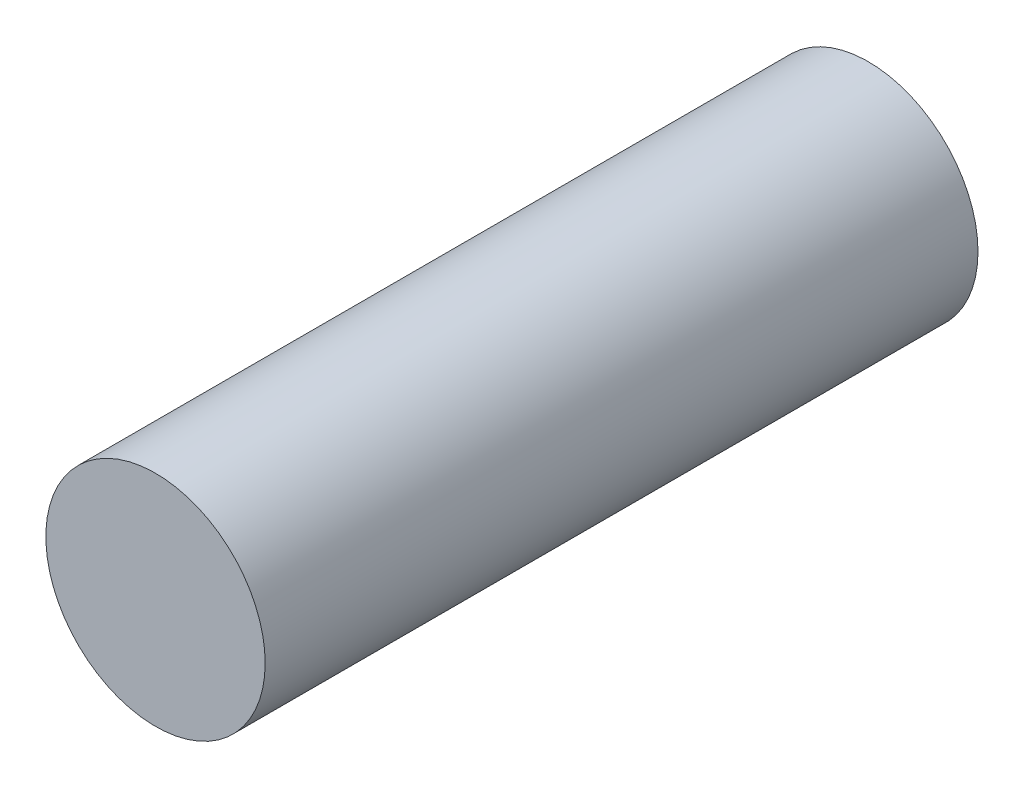
ISO-10303-21;
HEADER;
FILE_DESCRIPTION(('STEP AP214'),'2;1');
FILE_NAME('part.step','',(''),(''),'','','');
FILE_SCHEMA(('AUTOMOTIVE_DESIGN { 1 0 10303 214 1 1 1 1 }'));
ENDSEC;
DATA;
#1=APPLICATION_CONTEXT('core data for automotive mechanical design processes');
#2=APPLICATION_PROTOCOL_DEFINITION('international standard','automotive_design',2000,#1);
#3=PRODUCT_CONTEXT('',#1,'mechanical');
#4=PRODUCT('Part','Part','',(#3));
#5=PRODUCT_RELATED_PRODUCT_CATEGORY('part','',(#4));
#6=PRODUCT_DEFINITION_FORMATION('','',#4);
#7=PRODUCT_DEFINITION_CONTEXT('part definition',#1,'design');
#8=PRODUCT_DEFINITION('design','',#6,#7);
#9=PRODUCT_DEFINITION_SHAPE('','',#8);
#10=(LENGTH_UNIT() NAMED_UNIT(*) SI_UNIT(.MILLI.,.METRE.));
#11=(NAMED_UNIT(*) PLANE_ANGLE_UNIT() SI_UNIT($,.RADIAN.));
#12=(NAMED_UNIT(*) SI_UNIT($,.STERADIAN.) SOLID_ANGLE_UNIT());
#13=UNCERTAINTY_MEASURE_WITH_UNIT(LENGTH_MEASURE(1.E-05),#10,'distance_accuracy_value','');
#14=(GEOMETRIC_REPRESENTATION_CONTEXT(3) GLOBAL_UNCERTAINTY_ASSIGNED_CONTEXT((#13)) GLOBAL_UNIT_ASSIGNED_CONTEXT((#10,
#11,#12)) REPRESENTATION_CONTEXT('',''));
#15=CARTESIAN_POINT('',(0.,0.,0.));
#16=DIRECTION('',(0.,0.,1.));
#17=DIRECTION('',(1.,0.,0.));
#18=AXIS2_PLACEMENT_3D('',#15,#16,#17);
#19=CARTESIAN_POINT('',(21.,-43.,-4.5));
#20=DIRECTION('',(0.,0.,1.));
#21=DIRECTION('',(1.,0.,0.));
#22=AXIS2_PLACEMENT_3D('',#19,#20,#21);
#23=CYLINDRICAL_SURFACE('',#22,6.);
#24=CARTESIAN_POINT('',(21.,-43.,-4.5));
#25=DIRECTION('',(0.,0.,1.));
#26=DIRECTION('',(1.,0.,0.));
#27=AXIS2_PLACEMENT_3D('',#24,#25,#26);
#28=CIRCLE('',#27,6.);
#29=CARTESIAN_POINT('',(27.,-43.,-4.5));
#30=VERTEX_POINT('',#29);
#31=EDGE_CURVE('E10',#30,#30,#28,.T.);
#32=ORIENTED_EDGE('',*,*,#31,.T.);
#33=EDGE_LOOP('',(#32));
#34=FACE_BOUND('',#33,.T.);
#35=CARTESIAN_POINT('',(21.,-43.,34.5));
#36=DIRECTION('',(0.,0.,1.));
#37=DIRECTION('',(1.,0.,0.));
#38=AXIS2_PLACEMENT_3D('',#35,#36,#37);
#39=CIRCLE('',#38,6.);
#40=CARTESIAN_POINT('',(27.,-43.,34.5));
#41=VERTEX_POINT('',#40);
#42=EDGE_CURVE('E37',#41,#41,#39,.T.);
#43=ORIENTED_EDGE('',*,*,#42,.F.);
#44=EDGE_LOOP('',(#43));
#45=FACE_BOUND('',#44,.T.);
#46=ADVANCED_FACE('F31',(#34,#45),#23,.T.);
#47=CARTESIAN_POINT('',(27.,-43.,-4.5));
#48=DIRECTION('',(0.,0.,-1.));
#49=DIRECTION('',(-1.,0.,0.));
#50=AXIS2_PLACEMENT_3D('',#47,#48,#49);
#51=PLANE('',#50);
#52=ORIENTED_EDGE('',*,*,#31,.F.);
#53=EDGE_LOOP('',(#52));
#54=FACE_BOUND('',#53,.T.);
#55=ADVANCED_FACE('F46',(#54),#51,.T.);
#56=CARTESIAN_POINT('',(21.,-43.,34.5));
#57=DIRECTION('',(0.,0.,1.));
#58=DIRECTION('',(1.,0.,0.));
#59=AXIS2_PLACEMENT_3D('',#56,#57,#58);
#60=PLANE('',#59);
#61=ORIENTED_EDGE('',*,*,#42,.T.);
#62=EDGE_LOOP('',(#61));
#63=FACE_BOUND('',#62,.T.);
#64=ADVANCED_FACE('F43',(#63),#60,.T.);
#65=CLOSED_SHELL('',(#46,#55,#64));
#66=MANIFOLD_SOLID_BREP('B2',#65);
#67=ADVANCED_BREP_SHAPE_REPRESENTATION('',(#18,#66),#14);
#68=SHAPE_DEFINITION_REPRESENTATION(#9,#67);
ENDSEC;
END-ISO-10303-21;
